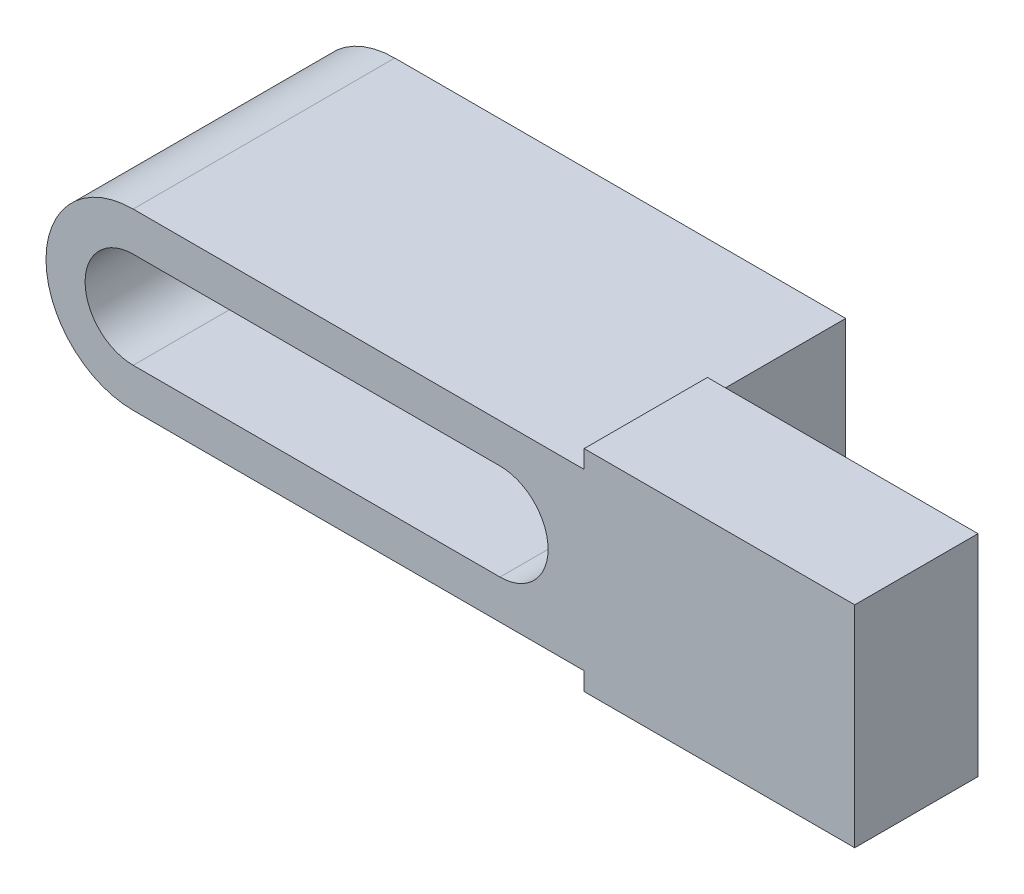
ISO-10303-21;
HEADER;
FILE_DESCRIPTION(('STEP AP214'),'2;1');
FILE_NAME('part.step','',(''),(''),'','','');
FILE_SCHEMA(('AUTOMOTIVE_DESIGN { 1 0 10303 214 1 1 1 1 }'));
ENDSEC;
DATA;
#1=APPLICATION_CONTEXT('core data for automotive mechanical design processes');
#2=APPLICATION_PROTOCOL_DEFINITION('international standard','automotive_design',2000,#1);
#3=PRODUCT_CONTEXT('',#1,'mechanical');
#4=PRODUCT('Part','Part','',(#3));
#5=PRODUCT_RELATED_PRODUCT_CATEGORY('part','',(#4));
#6=PRODUCT_DEFINITION_FORMATION('','',#4);
#7=PRODUCT_DEFINITION_CONTEXT('part definition',#1,'design');
#8=PRODUCT_DEFINITION('design','',#6,#7);
#9=PRODUCT_DEFINITION_SHAPE('','',#8);
#10=(LENGTH_UNIT() NAMED_UNIT(*) SI_UNIT(.MILLI.,.METRE.));
#11=(NAMED_UNIT(*) PLANE_ANGLE_UNIT() SI_UNIT($,.RADIAN.));
#12=(NAMED_UNIT(*) SI_UNIT($,.STERADIAN.) SOLID_ANGLE_UNIT());
#13=UNCERTAINTY_MEASURE_WITH_UNIT(LENGTH_MEASURE(1.E-05),#10,'distance_accuracy_value','');
#14=(GEOMETRIC_REPRESENTATION_CONTEXT(3) GLOBAL_UNCERTAINTY_ASSIGNED_CONTEXT((#13)) GLOBAL_UNIT_ASSIGNED_CONTEXT((#10,
#11,#12)) REPRESENTATION_CONTEXT('',''));
#15=CARTESIAN_POINT('',(0.,0.,0.));
#16=DIRECTION('',(0.,0.,1.));
#17=DIRECTION('',(1.,0.,0.));
#18=AXIS2_PLACEMENT_3D('',#15,#16,#17);
#19=CARTESIAN_POINT('',(0.,0.,4.6));
#20=DIRECTION('',(0.,0.,-1.));
#21=DIRECTION('',(-1.,0.,0.));
#22=AXIS2_PLACEMENT_3D('',#19,#20,#21);
#23=CYLINDRICAL_SURFACE('',#22,2.9);
#24=CARTESIAN_POINT('',(0.,0.,0.));
#25=DIRECTION('',(0.,0.,1.));
#26=DIRECTION('',(1.,0.,0.));
#27=AXIS2_PLACEMENT_3D('',#24,#25,#26);
#28=CIRCLE('',#27,2.9);
#29=CARTESIAN_POINT('',(0.,2.9,0.));
#30=VERTEX_POINT('',#29);
#31=CARTESIAN_POINT('',(0.,-2.9,0.));
#32=VERTEX_POINT('',#31);
#33=EDGE_CURVE('E213',#30,#32,#28,.T.);
#34=ORIENTED_EDGE('',*,*,#33,.T.);
#35=DIRECTION('',(0.,0.,-1.));
#36=VECTOR('',#35,1.);
#37=CARTESIAN_POINT('',(0.,-2.9,4.6));
#38=LINE('',#37,#36);
#39=CARTESIAN_POINT('',(0.,-2.9,8.7));
#40=VERTEX_POINT('',#39);
#41=EDGE_CURVE('E11',#40,#32,#38,.T.);
#42=ORIENTED_EDGE('',*,*,#41,.F.);
#43=CARTESIAN_POINT('',(0.,0.,8.7));
#44=DIRECTION('',(0.,0.,1.));
#45=DIRECTION('',(1.,0.,0.));
#46=AXIS2_PLACEMENT_3D('',#43,#44,#45);
#47=CIRCLE('',#46,2.9);
#48=CARTESIAN_POINT('',(0.,2.9,8.7));
#49=VERTEX_POINT('',#48);
#50=EDGE_CURVE('E167',#49,#40,#47,.T.);
#51=ORIENTED_EDGE('',*,*,#50,.F.);
#52=DIRECTION('',(0.,0.,-1.));
#53=VECTOR('',#52,1.);
#54=CARTESIAN_POINT('',(0.,2.9,4.6));
#55=LINE('',#54,#53);
#56=EDGE_CURVE('E217',#49,#30,#55,.T.);
#57=ORIENTED_EDGE('',*,*,#56,.T.);
#58=EDGE_LOOP('',(#34,#42,#51,#57));
#59=FACE_BOUND('',#58,.T.);
#60=ADVANCED_FACE('F36',(#59),#23,.T.);
#61=CARTESIAN_POINT('',(15.,-2.9,4.6));
#62=DIRECTION('',(0.,1.,0.));
#63=DIRECTION('',(-1.,0.,0.));
#64=AXIS2_PLACEMENT_3D('',#61,#62,#63);
#65=PLANE('',#64);
#66=DIRECTION('',(1.,0.,0.));
#67=VECTOR('',#66,1.);
#68=CARTESIAN_POINT('',(15.,-2.9,0.));
#69=LINE('',#68,#67);
#70=CARTESIAN_POINT('',(15.,-2.9,0.));
#71=VERTEX_POINT('',#70);
#72=EDGE_CURVE('E221',#32,#71,#69,.T.);
#73=ORIENTED_EDGE('',*,*,#72,.T.);
#74=DIRECTION('',(0.,0.,-1.));
#75=VECTOR('',#74,1.);
#76=CARTESIAN_POINT('',(15.,-2.9,4.6));
#77=LINE('',#76,#75);
#78=CARTESIAN_POINT('',(15.,-2.9,4.6));
#79=VERTEX_POINT('',#78);
#80=EDGE_CURVE('E43',#79,#71,#77,.T.);
#81=ORIENTED_EDGE('',*,*,#80,.F.);
#82=DIRECTION('',(0.,0.,-1.));
#83=VECTOR('',#82,1.);
#84=CARTESIAN_POINT('',(15.,-2.9,8.7));
#85=LINE('',#84,#83);
#86=CARTESIAN_POINT('',(15.,-2.9,8.7));
#87=VERTEX_POINT('',#86);
#88=EDGE_CURVE('E210',#87,#79,#85,.T.);
#89=ORIENTED_EDGE('',*,*,#88,.F.);
#90=DIRECTION('',(1.,0.,0.));
#91=VECTOR('',#90,1.);
#92=CARTESIAN_POINT('',(0.,-2.9,8.7));
#93=LINE('',#92,#91);
#94=EDGE_CURVE('E170',#40,#87,#93,.T.);
#95=ORIENTED_EDGE('',*,*,#94,.F.);
#96=ORIENTED_EDGE('',*,*,#41,.T.);
#97=EDGE_LOOP('',(#73,#81,#89,#95,#96));
#98=FACE_BOUND('',#97,.T.);
#99=ADVANCED_FACE('F283',(#98),#65,.F.);
#100=CARTESIAN_POINT('',(15.,2.9,4.6));
#101=DIRECTION('',(-1.,0.,0.));
#102=DIRECTION('',(0.,0.,1.));
#103=AXIS2_PLACEMENT_3D('',#100,#101,#102);
#104=PLANE('',#103);
#105=DIRECTION('',(0.,1.,0.));
#106=VECTOR('',#105,1.);
#107=CARTESIAN_POINT('',(15.,2.9,0.));
#108=LINE('',#107,#106);
#109=CARTESIAN_POINT('',(15.,2.9,0.));
#110=VERTEX_POINT('',#109);
#111=EDGE_CURVE('E223',#71,#110,#108,.T.);
#112=ORIENTED_EDGE('',*,*,#111,.T.);
#113=DIRECTION('',(0.,0.,-1.));
#114=VECTOR('',#113,1.);
#115=CARTESIAN_POINT('',(15.,2.9,4.6));
#116=LINE('',#115,#114);
#117=CARTESIAN_POINT('',(15.,2.9,4.6));
#118=VERTEX_POINT('',#117);
#119=EDGE_CURVE('E228',#118,#110,#116,.T.);
#120=ORIENTED_EDGE('',*,*,#119,.F.);
#121=DIRECTION('',(0.,1.,0.));
#122=VECTOR('',#121,1.);
#123=CARTESIAN_POINT('',(15.,2.9,4.6));
#124=LINE('',#123,#122);
#125=EDGE_CURVE('E214',#79,#118,#124,.T.);
#126=ORIENTED_EDGE('',*,*,#125,.F.);
#127=ORIENTED_EDGE('',*,*,#80,.T.);
#128=EDGE_LOOP('',(#112,#120,#126,#127));
#129=FACE_BOUND('',#128,.T.);
#130=ADVANCED_FACE('F234',(#129),#104,.F.);
#131=CARTESIAN_POINT('',(0.,2.9,4.6));
#132=DIRECTION('',(0.,-1.,0.));
#133=DIRECTION('',(1.,0.,0.));
#134=AXIS2_PLACEMENT_3D('',#131,#132,#133);
#135=PLANE('',#134);
#136=DIRECTION('',(-1.,0.,0.));
#137=VECTOR('',#136,1.);
#138=CARTESIAN_POINT('',(0.,2.9,0.));
#139=LINE('',#138,#137);
#140=EDGE_CURVE('E218',#110,#30,#139,.T.);
#141=ORIENTED_EDGE('',*,*,#140,.T.);
#142=ORIENTED_EDGE('',*,*,#56,.F.);
#143=DIRECTION('',(-1.,0.,0.));
#144=VECTOR('',#143,1.);
#145=CARTESIAN_POINT('',(15.,2.9,8.7));
#146=LINE('',#145,#144);
#147=CARTESIAN_POINT('',(15.,2.9,8.7));
#148=VERTEX_POINT('',#147);
#149=EDGE_CURVE('E183',#148,#49,#146,.T.);
#150=ORIENTED_EDGE('',*,*,#149,.F.);
#151=DIRECTION('',(0.,0.,-1.));
#152=VECTOR('',#151,1.);
#153=CARTESIAN_POINT('',(15.,2.9,8.7));
#154=LINE('',#153,#152);
#155=EDGE_CURVE('E186',#148,#118,#154,.T.);
#156=ORIENTED_EDGE('',*,*,#155,.T.);
#157=ORIENTED_EDGE('',*,*,#119,.T.);
#158=EDGE_LOOP('',(#141,#142,#150,#156,#157));
#159=FACE_BOUND('',#158,.T.);
#160=ADVANCED_FACE('F240',(#159),#135,.F.);
#161=CARTESIAN_POINT('',(0.,0.,0.));
#162=DIRECTION('',(0.,0.,1.));
#163=DIRECTION('',(1.,0.,0.));
#164=AXIS2_PLACEMENT_3D('',#161,#162,#163);
#165=PLANE('',#164);
#166=DIRECTION('',(1.,0.,0.));
#167=VECTOR('',#166,1.);
#168=CARTESIAN_POINT('',(12.2,-1.6,0.));
#169=LINE('',#168,#167);
#170=CARTESIAN_POINT('',(0.,-1.6,0.));
#171=VERTEX_POINT('',#170);
#172=CARTESIAN_POINT('',(12.2,-1.6,0.));
#173=VERTEX_POINT('',#172);
#174=EDGE_CURVE('E138',#171,#173,#169,.T.);
#175=ORIENTED_EDGE('',*,*,#174,.T.);
#176=CARTESIAN_POINT('',(12.2,0.,0.));
#177=DIRECTION('',(0.,0.,1.));
#178=DIRECTION('',(1.,0.,0.));
#179=AXIS2_PLACEMENT_3D('',#176,#177,#178);
#180=CIRCLE('',#179,1.6);
#181=CARTESIAN_POINT('',(12.2,1.6,0.));
#182=VERTEX_POINT('',#181);
#183=EDGE_CURVE('E132',#173,#182,#180,.T.);
#184=ORIENTED_EDGE('',*,*,#183,.T.);
#185=DIRECTION('',(-1.,0.,0.));
#186=VECTOR('',#185,1.);
#187=CARTESIAN_POINT('',(0.,1.6,0.));
#188=LINE('',#187,#186);
#189=CARTESIAN_POINT('',(0.,1.6,0.));
#190=VERTEX_POINT('',#189);
#191=EDGE_CURVE('E141',#182,#190,#188,.T.);
#192=ORIENTED_EDGE('',*,*,#191,.T.);
#193=CARTESIAN_POINT('',(0.,0.,0.));
#194=DIRECTION('',(0.,0.,1.));
#195=DIRECTION('',(1.,0.,0.));
#196=AXIS2_PLACEMENT_3D('',#193,#194,#195);
#197=CIRCLE('',#196,1.6);
#198=EDGE_CURVE('E50',#190,#171,#197,.T.);
#199=ORIENTED_EDGE('',*,*,#198,.T.);
#200=EDGE_LOOP('',(#175,#184,#192,#199));
#201=FACE_BOUND('',#200,.T.);
#202=ORIENTED_EDGE('',*,*,#33,.F.);
#203=ORIENTED_EDGE('',*,*,#140,.F.);
#204=ORIENTED_EDGE('',*,*,#111,.F.);
#205=ORIENTED_EDGE('',*,*,#72,.F.);
#206=EDGE_LOOP('',(#202,#203,#204,#205));
#207=FACE_BOUND('',#206,.T.);
#208=ADVANCED_FACE('F145',(#201,#207),#165,.F.);
#209=CARTESIAN_POINT('',(0.,0.,4.6));
#210=DIRECTION('',(0.,0.,1.));
#211=DIRECTION('',(1.,0.,0.));
#212=AXIS2_PLACEMENT_3D('',#209,#210,#211);
#213=PLANE('',#212);
#214=DIRECTION('',(0.,-1.,0.));
#215=VECTOR('',#214,1.);
#216=CARTESIAN_POINT('',(15.,-2.9,4.6));
#217=LINE('',#216,#215);
#218=CARTESIAN_POINT('',(15.,-3.5,4.6));
#219=VERTEX_POINT('',#218);
#220=EDGE_CURVE('E163',#79,#219,#217,.T.);
#221=ORIENTED_EDGE('',*,*,#220,.F.);
#222=ORIENTED_EDGE('',*,*,#125,.T.);
#223=DIRECTION('',(0.,-1.,0.));
#224=VECTOR('',#223,1.);
#225=CARTESIAN_POINT('',(15.,2.9,4.6));
#226=LINE('',#225,#224);
#227=CARTESIAN_POINT('',(15.,3.5,4.6));
#228=VERTEX_POINT('',#227);
#229=EDGE_CURVE('E171',#228,#118,#226,.T.);
#230=ORIENTED_EDGE('',*,*,#229,.F.);
#231=DIRECTION('',(-1.,0.,0.));
#232=VECTOR('',#231,1.);
#233=CARTESIAN_POINT('',(15.,3.5,4.6));
#234=LINE('',#233,#232);
#235=CARTESIAN_POINT('',(24.,3.5,4.6));
#236=VERTEX_POINT('',#235);
#237=EDGE_CURVE('E192',#236,#228,#234,.T.);
#238=ORIENTED_EDGE('',*,*,#237,.F.);
#239=DIRECTION('',(0.,1.,0.));
#240=VECTOR('',#239,1.);
#241=CARTESIAN_POINT('',(24.,3.5,4.6));
#242=LINE('',#241,#240);
#243=CARTESIAN_POINT('',(24.,-3.5,4.6));
#244=VERTEX_POINT('',#243);
#245=EDGE_CURVE('E190',#244,#236,#242,.T.);
#246=ORIENTED_EDGE('',*,*,#245,.F.);
#247=DIRECTION('',(1.,0.,0.));
#248=VECTOR('',#247,1.);
#249=CARTESIAN_POINT('',(15.,-3.5,4.6));
#250=LINE('',#249,#248);
#251=EDGE_CURVE('E188',#219,#244,#250,.T.);
#252=ORIENTED_EDGE('',*,*,#251,.F.);
#253=EDGE_LOOP('',(#221,#222,#230,#238,#246,#252));
#254=FACE_BOUND('',#253,.T.);
#255=ADVANCED_FACE('F256',(#254),#213,.F.);
#256=CARTESIAN_POINT('',(15.,-2.9,8.7));
#257=DIRECTION('',(1.,0.,0.));
#258=DIRECTION('',(0.,0.,-1.));
#259=AXIS2_PLACEMENT_3D('',#256,#257,#258);
#260=PLANE('',#259);
#261=ORIENTED_EDGE('',*,*,#220,.T.);
#262=DIRECTION('',(0.,0.,-1.));
#263=VECTOR('',#262,1.);
#264=CARTESIAN_POINT('',(15.,-3.5,8.7));
#265=LINE('',#264,#263);
#266=CARTESIAN_POINT('',(15.,-3.5,8.7));
#267=VERTEX_POINT('',#266);
#268=EDGE_CURVE('E207',#267,#219,#265,.T.);
#269=ORIENTED_EDGE('',*,*,#268,.F.);
#270=DIRECTION('',(0.,-1.,0.));
#271=VECTOR('',#270,1.);
#272=CARTESIAN_POINT('',(15.,-2.9,8.7));
#273=LINE('',#272,#271);
#274=EDGE_CURVE('E173',#87,#267,#273,.T.);
#275=ORIENTED_EDGE('',*,*,#274,.F.);
#276=ORIENTED_EDGE('',*,*,#88,.T.);
#277=EDGE_LOOP('',(#261,#269,#275,#276));
#278=FACE_BOUND('',#277,.T.);
#279=ADVANCED_FACE('F261',(#278),#260,.F.);
#280=CARTESIAN_POINT('',(15.,-3.5,8.7));
#281=DIRECTION('',(0.,1.,0.));
#282=DIRECTION('',(0.,0.,1.));
#283=AXIS2_PLACEMENT_3D('',#280,#281,#282);
#284=PLANE('',#283);
#285=ORIENTED_EDGE('',*,*,#251,.T.);
#286=DIRECTION('',(0.,0.,-1.));
#287=VECTOR('',#286,1.);
#288=CARTESIAN_POINT('',(24.,-3.5,8.7));
#289=LINE('',#288,#287);
#290=CARTESIAN_POINT('',(24.,-3.5,8.7));
#291=VERTEX_POINT('',#290);
#292=EDGE_CURVE('E204',#291,#244,#289,.T.);
#293=ORIENTED_EDGE('',*,*,#292,.F.);
#294=DIRECTION('',(1.,0.,0.));
#295=VECTOR('',#294,1.);
#296=CARTESIAN_POINT('',(15.,-3.5,8.7));
#297=LINE('',#296,#295);
#298=EDGE_CURVE('E175',#267,#291,#297,.T.);
#299=ORIENTED_EDGE('',*,*,#298,.F.);
#300=ORIENTED_EDGE('',*,*,#268,.T.);
#301=EDGE_LOOP('',(#285,#293,#299,#300));
#302=FACE_BOUND('',#301,.T.);
#303=ADVANCED_FACE('F265',(#302),#284,.F.);
#304=CARTESIAN_POINT('',(24.,3.5,8.7));
#305=DIRECTION('',(-1.,0.,0.));
#306=DIRECTION('',(0.,0.,1.));
#307=AXIS2_PLACEMENT_3D('',#304,#305,#306);
#308=PLANE('',#307);
#309=ORIENTED_EDGE('',*,*,#245,.T.);
#310=DIRECTION('',(0.,0.,-1.));
#311=VECTOR('',#310,1.);
#312=CARTESIAN_POINT('',(24.,3.5,8.7));
#313=LINE('',#312,#311);
#314=CARTESIAN_POINT('',(24.,3.5,8.7));
#315=VERTEX_POINT('',#314);
#316=EDGE_CURVE('E201',#315,#236,#313,.T.);
#317=ORIENTED_EDGE('',*,*,#316,.F.);
#318=DIRECTION('',(0.,1.,0.));
#319=VECTOR('',#318,1.);
#320=CARTESIAN_POINT('',(24.,3.5,8.7));
#321=LINE('',#320,#319);
#322=EDGE_CURVE('E177',#291,#315,#321,.T.);
#323=ORIENTED_EDGE('',*,*,#322,.F.);
#324=ORIENTED_EDGE('',*,*,#292,.T.);
#325=EDGE_LOOP('',(#309,#317,#323,#324));
#326=FACE_BOUND('',#325,.T.);
#327=ADVANCED_FACE('F271',(#326),#308,.F.);
#328=CARTESIAN_POINT('',(15.,3.5,8.7));
#329=DIRECTION('',(0.,-1.,0.));
#330=DIRECTION('',(0.,0.,-1.));
#331=AXIS2_PLACEMENT_3D('',#328,#329,#330);
#332=PLANE('',#331);
#333=ORIENTED_EDGE('',*,*,#237,.T.);
#334=DIRECTION('',(0.,0.,-1.));
#335=VECTOR('',#334,1.);
#336=CARTESIAN_POINT('',(15.,3.5,8.7));
#337=LINE('',#336,#335);
#338=CARTESIAN_POINT('',(15.,3.5,8.7));
#339=VERTEX_POINT('',#338);
#340=EDGE_CURVE('E198',#339,#228,#337,.T.);
#341=ORIENTED_EDGE('',*,*,#340,.F.);
#342=DIRECTION('',(-1.,0.,0.));
#343=VECTOR('',#342,1.);
#344=CARTESIAN_POINT('',(15.,3.5,8.7));
#345=LINE('',#344,#343);
#346=EDGE_CURVE('E179',#315,#339,#345,.T.);
#347=ORIENTED_EDGE('',*,*,#346,.F.);
#348=ORIENTED_EDGE('',*,*,#316,.T.);
#349=EDGE_LOOP('',(#333,#341,#347,#348));
#350=FACE_BOUND('',#349,.T.);
#351=ADVANCED_FACE('F273',(#350),#332,.F.);
#352=CARTESIAN_POINT('',(15.,2.9,8.7));
#353=DIRECTION('',(1.,0.,0.));
#354=DIRECTION('',(0.,0.,-1.));
#355=AXIS2_PLACEMENT_3D('',#352,#353,#354);
#356=PLANE('',#355);
#357=ORIENTED_EDGE('',*,*,#229,.T.);
#358=ORIENTED_EDGE('',*,*,#155,.F.);
#359=DIRECTION('',(0.,-1.,0.));
#360=VECTOR('',#359,1.);
#361=CARTESIAN_POINT('',(15.,2.9,8.7));
#362=LINE('',#361,#360);
#363=EDGE_CURVE('E181',#339,#148,#362,.T.);
#364=ORIENTED_EDGE('',*,*,#363,.F.);
#365=ORIENTED_EDGE('',*,*,#340,.T.);
#366=EDGE_LOOP('',(#357,#358,#364,#365));
#367=FACE_BOUND('',#366,.T.);
#368=ADVANCED_FACE('F250',(#367),#356,.F.);
#369=CARTESIAN_POINT('',(0.,0.,8.7));
#370=DIRECTION('',(0.,0.,1.));
#371=DIRECTION('',(1.,0.,0.));
#372=AXIS2_PLACEMENT_3D('',#369,#370,#371);
#373=PLANE('',#372);
#374=CARTESIAN_POINT('',(12.2,0.,8.7));
#375=DIRECTION('',(0.,0.,1.));
#376=DIRECTION('',(1.,0.,0.));
#377=AXIS2_PLACEMENT_3D('',#374,#375,#376);
#378=CIRCLE('',#377,1.6);
#379=CARTESIAN_POINT('',(12.2,-1.6,8.7));
#380=VERTEX_POINT('',#379);
#381=CARTESIAN_POINT('',(12.2,1.6,8.7));
#382=VERTEX_POINT('',#381);
#383=EDGE_CURVE('E58',#380,#382,#378,.T.);
#384=ORIENTED_EDGE('',*,*,#383,.F.);
#385=DIRECTION('',(1.,0.,0.));
#386=VECTOR('',#385,1.);
#387=CARTESIAN_POINT('',(12.2,-1.6,8.7));
#388=LINE('',#387,#386);
#389=CARTESIAN_POINT('',(0.,-1.6,8.7));
#390=VERTEX_POINT('',#389);
#391=EDGE_CURVE('E148',#390,#380,#388,.T.);
#392=ORIENTED_EDGE('',*,*,#391,.F.);
#393=CARTESIAN_POINT('',(0.,0.,8.7));
#394=DIRECTION('',(0.,0.,1.));
#395=DIRECTION('',(1.,0.,0.));
#396=AXIS2_PLACEMENT_3D('',#393,#394,#395);
#397=CIRCLE('',#396,1.6);
#398=CARTESIAN_POINT('',(0.,1.6,8.7));
#399=VERTEX_POINT('',#398);
#400=EDGE_CURVE('E151',#399,#390,#397,.T.);
#401=ORIENTED_EDGE('',*,*,#400,.F.);
#402=DIRECTION('',(-1.,0.,0.));
#403=VECTOR('',#402,1.);
#404=CARTESIAN_POINT('',(0.,1.6,8.7));
#405=LINE('',#404,#403);
#406=EDGE_CURVE('E157',#382,#399,#405,.T.);
#407=ORIENTED_EDGE('',*,*,#406,.F.);
#408=EDGE_LOOP('',(#384,#392,#401,#407));
#409=FACE_BOUND('',#408,.T.);
#410=ORIENTED_EDGE('',*,*,#50,.T.);
#411=ORIENTED_EDGE('',*,*,#94,.T.);
#412=ORIENTED_EDGE('',*,*,#274,.T.);
#413=ORIENTED_EDGE('',*,*,#298,.T.);
#414=ORIENTED_EDGE('',*,*,#322,.T.);
#415=ORIENTED_EDGE('',*,*,#346,.T.);
#416=ORIENTED_EDGE('',*,*,#363,.T.);
#417=ORIENTED_EDGE('',*,*,#149,.T.);
#418=EDGE_LOOP('',(#410,#411,#412,#413,#414,#415,#416,#417));
#419=FACE_BOUND('',#418,.T.);
#420=ADVANCED_FACE('F246',(#409,#419),#373,.T.);
#421=CARTESIAN_POINT('',(12.2,0.,0.));
#422=DIRECTION('',(0.,0.,1.));
#423=DIRECTION('',(1.,0.,0.));
#424=AXIS2_PLACEMENT_3D('',#421,#422,#423);
#425=CYLINDRICAL_SURFACE('',#424,1.6);
#426=ORIENTED_EDGE('',*,*,#383,.T.);
#427=DIRECTION('',(0.,0.,1.));
#428=VECTOR('',#427,1.);
#429=CARTESIAN_POINT('',(12.2,1.6,0.));
#430=LINE('',#429,#428);
#431=EDGE_CURVE('E128',#182,#382,#430,.T.);
#432=ORIENTED_EDGE('',*,*,#431,.F.);
#433=ORIENTED_EDGE('',*,*,#183,.F.);
#434=DIRECTION('',(0.,0.,1.));
#435=VECTOR('',#434,1.);
#436=CARTESIAN_POINT('',(12.2,-1.6,0.));
#437=LINE('',#436,#435);
#438=EDGE_CURVE('E161',#173,#380,#437,.T.);
#439=ORIENTED_EDGE('',*,*,#438,.T.);
#440=EDGE_LOOP('',(#426,#432,#433,#439));
#441=FACE_BOUND('',#440,.T.);
#442=ADVANCED_FACE('F130',(#441),#425,.F.);
#443=CARTESIAN_POINT('',(12.2,-1.6,0.));
#444=DIRECTION('',(0.,-1.,0.));
#445=DIRECTION('',(1.,0.,0.));
#446=AXIS2_PLACEMENT_3D('',#443,#444,#445);
#447=PLANE('',#446);
#448=ORIENTED_EDGE('',*,*,#391,.T.);
#449=ORIENTED_EDGE('',*,*,#438,.F.);
#450=ORIENTED_EDGE('',*,*,#174,.F.);
#451=DIRECTION('',(0.,0.,1.));
#452=VECTOR('',#451,1.);
#453=CARTESIAN_POINT('',(0.,-1.6,0.));
#454=LINE('',#453,#452);
#455=EDGE_CURVE('E164',#171,#390,#454,.T.);
#456=ORIENTED_EDGE('',*,*,#455,.T.);
#457=EDGE_LOOP('',(#448,#449,#450,#456));
#458=FACE_BOUND('',#457,.T.);
#459=ADVANCED_FACE('F344',(#458),#447,.F.);
#460=CARTESIAN_POINT('',(0.,0.,0.));
#461=DIRECTION('',(0.,0.,1.));
#462=DIRECTION('',(1.,0.,0.));
#463=AXIS2_PLACEMENT_3D('',#460,#461,#462);
#464=CYLINDRICAL_SURFACE('',#463,1.6);
#465=ORIENTED_EDGE('',*,*,#400,.T.);
#466=ORIENTED_EDGE('',*,*,#455,.F.);
#467=ORIENTED_EDGE('',*,*,#198,.F.);
#468=DIRECTION('',(0.,0.,1.));
#469=VECTOR('',#468,1.);
#470=CARTESIAN_POINT('',(0.,1.6,0.));
#471=LINE('',#470,#469);
#472=EDGE_CURVE('E137',#190,#399,#471,.T.);
#473=ORIENTED_EDGE('',*,*,#472,.T.);
#474=EDGE_LOOP('',(#465,#466,#467,#473));
#475=FACE_BOUND('',#474,.T.);
#476=ADVANCED_FACE('F353',(#475),#464,.F.);
#477=CARTESIAN_POINT('',(0.,1.6,0.));
#478=DIRECTION('',(0.,1.,0.));
#479=DIRECTION('',(-1.,0.,0.));
#480=AXIS2_PLACEMENT_3D('',#477,#478,#479);
#481=PLANE('',#480);
#482=ORIENTED_EDGE('',*,*,#406,.T.);
#483=ORIENTED_EDGE('',*,*,#472,.F.);
#484=ORIENTED_EDGE('',*,*,#191,.F.);
#485=ORIENTED_EDGE('',*,*,#431,.T.);
#486=EDGE_LOOP('',(#482,#483,#484,#485));
#487=FACE_BOUND('',#486,.T.);
#488=ADVANCED_FACE('F142',(#487),#481,.F.);
#489=CLOSED_SHELL('',(#60,#99,#130,#160,#208,#255,#279,#303,#327,#351,#368,#420,#442,#459,#476,#488));
#490=MANIFOLD_SOLID_BREP('B2',#489);
#491=ADVANCED_BREP_SHAPE_REPRESENTATION('',(#18,#490),#14);
#492=SHAPE_DEFINITION_REPRESENTATION(#9,#491);
ENDSEC;
END-ISO-10303-21;
